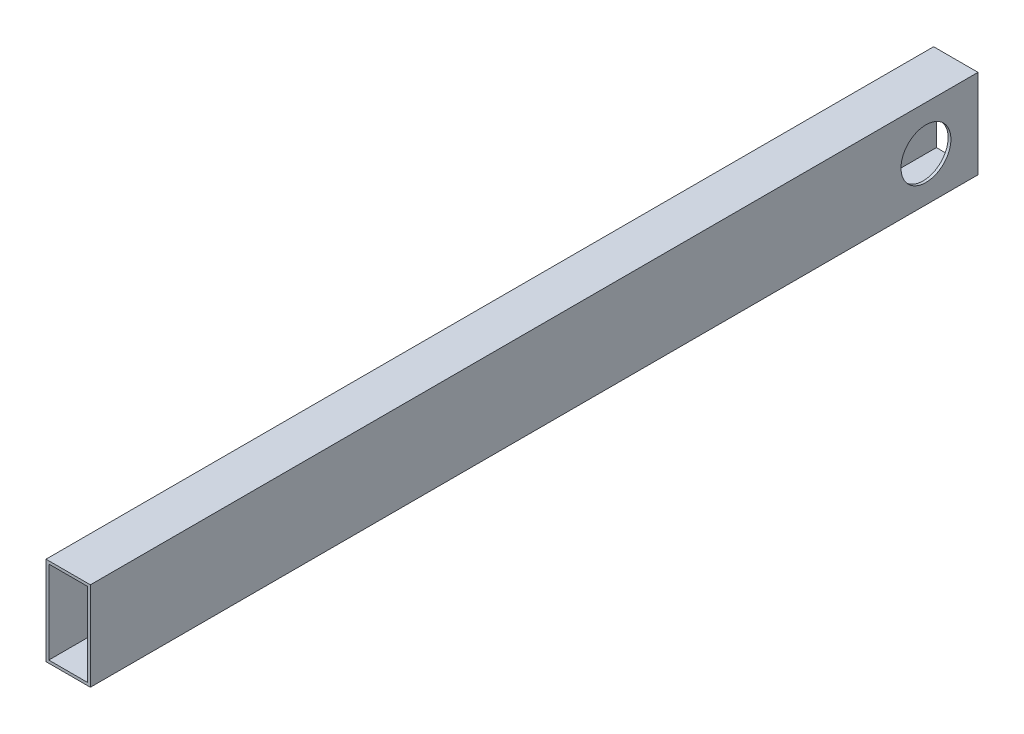
ISO-10303-21;
HEADER;
FILE_DESCRIPTION(('STEP AP214'),'2;1');
FILE_NAME('part.step','',(''),(''),'','','');
FILE_SCHEMA(('AUTOMOTIVE_DESIGN { 1 0 10303 214 1 1 1 1 }'));
ENDSEC;
DATA;
#1=APPLICATION_CONTEXT('core data for automotive mechanical design processes');
#2=APPLICATION_PROTOCOL_DEFINITION('international standard','automotive_design',2000,#1);
#3=PRODUCT_CONTEXT('',#1,'mechanical');
#4=PRODUCT('Part','Part','',(#3));
#5=PRODUCT_RELATED_PRODUCT_CATEGORY('part','',(#4));
#6=PRODUCT_DEFINITION_FORMATION('','',#4);
#7=PRODUCT_DEFINITION_CONTEXT('part definition',#1,'design');
#8=PRODUCT_DEFINITION('design','',#6,#7);
#9=PRODUCT_DEFINITION_SHAPE('','',#8);
#10=(LENGTH_UNIT() NAMED_UNIT(*) SI_UNIT(.MILLI.,.METRE.));
#11=(NAMED_UNIT(*) PLANE_ANGLE_UNIT() SI_UNIT($,.RADIAN.));
#12=(NAMED_UNIT(*) SI_UNIT($,.STERADIAN.) SOLID_ANGLE_UNIT());
#13=UNCERTAINTY_MEASURE_WITH_UNIT(LENGTH_MEASURE(1.E-05),#10,'distance_accuracy_value','');
#14=(GEOMETRIC_REPRESENTATION_CONTEXT(3) GLOBAL_UNCERTAINTY_ASSIGNED_CONTEXT((#13)) GLOBAL_UNIT_ASSIGNED_CONTEXT((#10,
#11,#12)) REPRESENTATION_CONTEXT('',''));
#15=CARTESIAN_POINT('',(0.,0.,0.));
#16=DIRECTION('',(0.,0.,1.));
#17=DIRECTION('',(1.,0.,0.));
#18=AXIS2_PLACEMENT_3D('',#15,#16,#17);
#19=CARTESIAN_POINT('',(0.,0.,254.));
#20=DIRECTION('',(0.,0.,-1.));
#21=DIRECTION('',(-1.,0.,0.));
#22=AXIS2_PLACEMENT_3D('',#19,#20,#21);
#23=PLANE('',#22);
#24=DIRECTION('',(0.,1.,0.));
#25=VECTOR('',#24,1.);
#26=CARTESIAN_POINT('',(12.7,-25.4,254.));
#27=LINE('',#26,#25);
#28=CARTESIAN_POINT('',(12.7,-25.4,254.));
#29=VERTEX_POINT('',#28);
#30=CARTESIAN_POINT('',(12.7,25.4,254.));
#31=VERTEX_POINT('',#30);
#32=EDGE_CURVE('E155',#29,#31,#27,.T.);
#33=ORIENTED_EDGE('',*,*,#32,.T.);
#34=DIRECTION('',(-1.,0.,0.));
#35=VECTOR('',#34,1.);
#36=CARTESIAN_POINT('',(-12.7,25.4,254.));
#37=LINE('',#36,#35);
#38=CARTESIAN_POINT('',(-12.7,25.4,254.));
#39=VERTEX_POINT('',#38);
#40=EDGE_CURVE('E159',#31,#39,#37,.T.);
#41=ORIENTED_EDGE('',*,*,#40,.T.);
#42=DIRECTION('',(0.,-1.,0.));
#43=VECTOR('',#42,1.);
#44=CARTESIAN_POINT('',(-12.7,-25.4,254.));
#45=LINE('',#44,#43);
#46=CARTESIAN_POINT('',(-12.7,-25.4,254.));
#47=VERTEX_POINT('',#46);
#48=EDGE_CURVE('E163',#39,#47,#45,.T.);
#49=ORIENTED_EDGE('',*,*,#48,.T.);
#50=DIRECTION('',(1.,0.,0.));
#51=VECTOR('',#50,1.);
#52=CARTESIAN_POINT('',(-12.7,-25.4,254.));
#53=LINE('',#52,#51);
#54=EDGE_CURVE('E166',#47,#29,#53,.T.);
#55=ORIENTED_EDGE('',*,*,#54,.T.);
#56=EDGE_LOOP('',(#33,#41,#49,#55));
#57=FACE_BOUND('',#56,.T.);
#58=DIRECTION('',(1.,0.,0.));
#59=VECTOR('',#58,1.);
#60=CARTESIAN_POINT('',(-11.1125,-23.8125,254.));
#61=LINE('',#60,#59);
#62=CARTESIAN_POINT('',(-11.1125,-23.8125,254.));
#63=VERTEX_POINT('',#62);
#64=CARTESIAN_POINT('',(11.1125,-23.8125,254.));
#65=VERTEX_POINT('',#64);
#66=EDGE_CURVE('E105',#63,#65,#61,.T.);
#67=ORIENTED_EDGE('',*,*,#66,.F.);
#68=DIRECTION('',(0.,-1.,0.));
#69=VECTOR('',#68,1.);
#70=CARTESIAN_POINT('',(-11.1125,-23.8125,254.));
#71=LINE('',#70,#69);
#72=CARTESIAN_POINT('',(-11.1125,23.8125,254.));
#73=VERTEX_POINT('',#72);
#74=EDGE_CURVE('E131',#73,#63,#71,.T.);
#75=ORIENTED_EDGE('',*,*,#74,.F.);
#76=DIRECTION('',(-1.,0.,0.));
#77=VECTOR('',#76,1.);
#78=CARTESIAN_POINT('',(-11.1125,23.8125,254.));
#79=LINE('',#78,#77);
#80=CARTESIAN_POINT('',(11.1125,23.8125,254.));
#81=VERTEX_POINT('',#80);
#82=EDGE_CURVE('E127',#81,#73,#79,.T.);
#83=ORIENTED_EDGE('',*,*,#82,.F.);
#84=DIRECTION('',(0.,1.,0.));
#85=VECTOR('',#84,1.);
#86=CARTESIAN_POINT('',(11.1125,-23.8125,254.));
#87=LINE('',#86,#85);
#88=EDGE_CURVE('E114',#65,#81,#87,.T.);
#89=ORIENTED_EDGE('',*,*,#88,.F.);
#90=EDGE_LOOP('',(#67,#75,#83,#89));
#91=FACE_BOUND('',#90,.T.);
#92=ADVANCED_FACE('F38',(#57,#91),#23,.F.);
#93=CARTESIAN_POINT('',(0.,0.,-254.));
#94=DIRECTION('',(0.,0.,-1.));
#95=DIRECTION('',(-1.,0.,0.));
#96=AXIS2_PLACEMENT_3D('',#93,#94,#95);
#97=PLANE('',#96);
#98=DIRECTION('',(0.,1.,0.));
#99=VECTOR('',#98,1.);
#100=CARTESIAN_POINT('',(12.7,-25.4,-254.));
#101=LINE('',#100,#99);
#102=CARTESIAN_POINT('',(12.7,-25.4,-254.));
#103=VERTEX_POINT('',#102);
#104=CARTESIAN_POINT('',(12.7,25.4,-254.));
#105=VERTEX_POINT('',#104);
#106=EDGE_CURVE('E123',#103,#105,#101,.T.);
#107=ORIENTED_EDGE('',*,*,#106,.F.);
#108=DIRECTION('',(1.,0.,0.));
#109=VECTOR('',#108,1.);
#110=CARTESIAN_POINT('',(-12.7,-25.4,-254.));
#111=LINE('',#110,#109);
#112=CARTESIAN_POINT('',(-12.7,-25.4,-254.));
#113=VERTEX_POINT('',#112);
#114=EDGE_CURVE('E160',#113,#103,#111,.T.);
#115=ORIENTED_EDGE('',*,*,#114,.F.);
#116=DIRECTION('',(0.,-1.,0.));
#117=VECTOR('',#116,1.);
#118=CARTESIAN_POINT('',(-12.7,-25.4,-254.));
#119=LINE('',#118,#117);
#120=CARTESIAN_POINT('',(-12.7,25.4,-254.));
#121=VERTEX_POINT('',#120);
#122=EDGE_CURVE('E176',#121,#113,#119,.T.);
#123=ORIENTED_EDGE('',*,*,#122,.F.);
#124=DIRECTION('',(-1.,0.,0.));
#125=VECTOR('',#124,1.);
#126=CARTESIAN_POINT('',(-12.7,25.4,-254.));
#127=LINE('',#126,#125);
#128=EDGE_CURVE('E173',#105,#121,#127,.T.);
#129=ORIENTED_EDGE('',*,*,#128,.F.);
#130=EDGE_LOOP('',(#107,#115,#123,#129));
#131=FACE_BOUND('',#130,.T.);
#132=DIRECTION('',(0.,-1.,0.));
#133=VECTOR('',#132,1.);
#134=CARTESIAN_POINT('',(-11.1125,-23.8125,-254.));
#135=LINE('',#134,#133);
#136=CARTESIAN_POINT('',(-11.1125,23.8125,-254.));
#137=VERTEX_POINT('',#136);
#138=CARTESIAN_POINT('',(-11.1125,-23.8125,-254.));
#139=VERTEX_POINT('',#138);
#140=EDGE_CURVE('E115',#137,#139,#135,.T.);
#141=ORIENTED_EDGE('',*,*,#140,.T.);
#142=DIRECTION('',(1.,0.,0.));
#143=VECTOR('',#142,1.);
#144=CARTESIAN_POINT('',(-11.1125,-23.8125,-254.));
#145=LINE('',#144,#143);
#146=CARTESIAN_POINT('',(11.1125,-23.8125,-254.));
#147=VERTEX_POINT('',#146);
#148=EDGE_CURVE('E63',#139,#147,#145,.T.);
#149=ORIENTED_EDGE('',*,*,#148,.T.);
#150=DIRECTION('',(0.,1.,0.));
#151=VECTOR('',#150,1.);
#152=CARTESIAN_POINT('',(11.1125,-23.8125,-254.));
#153=LINE('',#152,#151);
#154=CARTESIAN_POINT('',(11.1125,23.8125,-254.));
#155=VERTEX_POINT('',#154);
#156=EDGE_CURVE('E121',#147,#155,#153,.T.);
#157=ORIENTED_EDGE('',*,*,#156,.T.);
#158=DIRECTION('',(-1.,0.,0.));
#159=VECTOR('',#158,1.);
#160=CARTESIAN_POINT('',(-11.1125,23.8125,-254.));
#161=LINE('',#160,#159);
#162=EDGE_CURVE('E142',#155,#137,#161,.T.);
#163=ORIENTED_EDGE('',*,*,#162,.T.);
#164=EDGE_LOOP('',(#141,#149,#157,#163));
#165=FACE_BOUND('',#164,.T.);
#166=ADVANCED_FACE('F200',(#131,#165),#97,.T.);
#167=CARTESIAN_POINT('',(12.7,-25.4,254.));
#168=DIRECTION('',(-1.,0.,0.));
#169=DIRECTION('',(0.,0.,1.));
#170=AXIS2_PLACEMENT_3D('',#167,#168,#169);
#171=PLANE('',#170);
#172=CARTESIAN_POINT('',(12.7,0.,-224.210207487407));
#173=DIRECTION('',(1.,0.,0.));
#174=DIRECTION('',(0.,0.,-1.));
#175=AXIS2_PLACEMENT_3D('',#172,#173,#174);
#176=CIRCLE('',#175,14.2875);
#177=CARTESIAN_POINT('',(12.7,0.,-238.497707487407));
#178=VERTEX_POINT('',#177);
#179=EDGE_CURVE('E266',#178,#178,#176,.T.);
#180=ORIENTED_EDGE('',*,*,#179,.F.);
#181=EDGE_LOOP('',(#180));
#182=FACE_BOUND('',#181,.T.);
#183=ORIENTED_EDGE('',*,*,#106,.T.);
#184=DIRECTION('',(0.,0.,-1.));
#185=VECTOR('',#184,1.);
#186=CARTESIAN_POINT('',(12.7,25.4,254.));
#187=LINE('',#186,#185);
#188=EDGE_CURVE('E11',#31,#105,#187,.T.);
#189=ORIENTED_EDGE('',*,*,#188,.F.);
#190=ORIENTED_EDGE('',*,*,#32,.F.);
#191=DIRECTION('',(0.,0.,-1.));
#192=VECTOR('',#191,1.);
#193=CARTESIAN_POINT('',(12.7,-25.4,254.));
#194=LINE('',#193,#192);
#195=EDGE_CURVE('E169',#29,#103,#194,.T.);
#196=ORIENTED_EDGE('',*,*,#195,.T.);
#197=EDGE_LOOP('',(#183,#189,#190,#196));
#198=FACE_BOUND('',#197,.T.);
#199=ADVANCED_FACE('F40',(#182,#198),#171,.F.);
#200=CARTESIAN_POINT('',(-12.7,25.4,254.));
#201=DIRECTION('',(0.,-1.,0.));
#202=DIRECTION('',(0.,0.,-1.));
#203=AXIS2_PLACEMENT_3D('',#200,#201,#202);
#204=PLANE('',#203);
#205=ORIENTED_EDGE('',*,*,#128,.T.);
#206=DIRECTION('',(0.,0.,-1.));
#207=VECTOR('',#206,1.);
#208=CARTESIAN_POINT('',(-12.7,25.4,254.));
#209=LINE('',#208,#207);
#210=EDGE_CURVE('E48',#39,#121,#209,.T.);
#211=ORIENTED_EDGE('',*,*,#210,.F.);
#212=ORIENTED_EDGE('',*,*,#40,.F.);
#213=ORIENTED_EDGE('',*,*,#188,.T.);
#214=EDGE_LOOP('',(#205,#211,#212,#213));
#215=FACE_BOUND('',#214,.T.);
#216=ADVANCED_FACE('F210',(#215),#204,.F.);
#217=CARTESIAN_POINT('',(-12.7,-25.4,254.));
#218=DIRECTION('',(1.,0.,0.));
#219=DIRECTION('',(0.,0.,-1.));
#220=AXIS2_PLACEMENT_3D('',#217,#218,#219);
#221=PLANE('',#220);
#222=CARTESIAN_POINT('',(-12.7,0.,-224.210207487407));
#223=DIRECTION('',(1.,0.,0.));
#224=DIRECTION('',(0.,0.,-1.));
#225=AXIS2_PLACEMENT_3D('',#222,#223,#224);
#226=CIRCLE('',#225,14.2875);
#227=CARTESIAN_POINT('',(-12.7,0.,-238.497707487407));
#228=VERTEX_POINT('',#227);
#229=EDGE_CURVE('E264',#228,#228,#226,.T.);
#230=ORIENTED_EDGE('',*,*,#229,.T.);
#231=EDGE_LOOP('',(#230));
#232=FACE_BOUND('',#231,.T.);
#233=ORIENTED_EDGE('',*,*,#122,.T.);
#234=DIRECTION('',(0.,0.,-1.));
#235=VECTOR('',#234,1.);
#236=CARTESIAN_POINT('',(-12.7,-25.4,254.));
#237=LINE('',#236,#235);
#238=EDGE_CURVE('E184',#47,#113,#237,.T.);
#239=ORIENTED_EDGE('',*,*,#238,.F.);
#240=ORIENTED_EDGE('',*,*,#48,.F.);
#241=ORIENTED_EDGE('',*,*,#210,.T.);
#242=EDGE_LOOP('',(#233,#239,#240,#241));
#243=FACE_BOUND('',#242,.T.);
#244=ADVANCED_FACE('F194',(#232,#243),#221,.F.);
#245=CARTESIAN_POINT('',(-12.7,-25.4,254.));
#246=DIRECTION('',(0.,1.,0.));
#247=DIRECTION('',(0.,0.,1.));
#248=AXIS2_PLACEMENT_3D('',#245,#246,#247);
#249=PLANE('',#248);
#250=ORIENTED_EDGE('',*,*,#114,.T.);
#251=ORIENTED_EDGE('',*,*,#195,.F.);
#252=ORIENTED_EDGE('',*,*,#54,.F.);
#253=ORIENTED_EDGE('',*,*,#238,.T.);
#254=EDGE_LOOP('',(#250,#251,#252,#253));
#255=FACE_BOUND('',#254,.T.);
#256=ADVANCED_FACE('F204',(#255),#249,.F.);
#257=CARTESIAN_POINT('',(-11.1125,-23.8125,254.));
#258=DIRECTION('',(0.,1.,0.));
#259=DIRECTION('',(0.,0.,1.));
#260=AXIS2_PLACEMENT_3D('',#257,#258,#259);
#261=PLANE('',#260);
#262=ORIENTED_EDGE('',*,*,#148,.F.);
#263=DIRECTION('',(0.,0.,-1.));
#264=VECTOR('',#263,1.);
#265=CARTESIAN_POINT('',(-11.1125,-23.8125,254.));
#266=LINE('',#265,#264);
#267=EDGE_CURVE('E109',#63,#139,#266,.T.);
#268=ORIENTED_EDGE('',*,*,#267,.F.);
#269=ORIENTED_EDGE('',*,*,#66,.T.);
#270=DIRECTION('',(0.,0.,-1.));
#271=VECTOR('',#270,1.);
#272=CARTESIAN_POINT('',(11.1125,-23.8125,254.));
#273=LINE('',#272,#271);
#274=EDGE_CURVE('E108',#65,#147,#273,.T.);
#275=ORIENTED_EDGE('',*,*,#274,.T.);
#276=EDGE_LOOP('',(#262,#268,#269,#275));
#277=FACE_BOUND('',#276,.T.);
#278=ADVANCED_FACE('F107',(#277),#261,.T.);
#279=CARTESIAN_POINT('',(11.1125,-23.8125,254.));
#280=DIRECTION('',(-1.,0.,0.));
#281=DIRECTION('',(0.,-1.,0.));
#282=AXIS2_PLACEMENT_3D('',#279,#280,#281);
#283=PLANE('',#282);
#284=CARTESIAN_POINT('',(11.1125,0.,-224.210207487407));
#285=DIRECTION('',(-1.,0.,0.));
#286=DIRECTION('',(0.,-1.,0.));
#287=AXIS2_PLACEMENT_3D('',#284,#285,#286);
#288=CIRCLE('',#287,14.2875);
#289=CARTESIAN_POINT('',(11.1125,-14.2875,-224.210207487407));
#290=VERTEX_POINT('',#289);
#291=EDGE_CURVE('E139',#290,#290,#288,.T.);
#292=ORIENTED_EDGE('',*,*,#291,.F.);
#293=EDGE_LOOP('',(#292));
#294=FACE_BOUND('',#293,.T.);
#295=ORIENTED_EDGE('',*,*,#156,.F.);
#296=ORIENTED_EDGE('',*,*,#274,.F.);
#297=ORIENTED_EDGE('',*,*,#88,.T.);
#298=DIRECTION('',(0.,0.,-1.));
#299=VECTOR('',#298,1.);
#300=CARTESIAN_POINT('',(11.1125,23.8125,254.));
#301=LINE('',#300,#299);
#302=EDGE_CURVE('E124',#81,#155,#301,.T.);
#303=ORIENTED_EDGE('',*,*,#302,.T.);
#304=EDGE_LOOP('',(#295,#296,#297,#303));
#305=FACE_BOUND('',#304,.T.);
#306=ADVANCED_FACE('F118',(#294,#305),#283,.T.);
#307=CARTESIAN_POINT('',(-11.1125,23.8125,254.));
#308=DIRECTION('',(0.,-1.,0.));
#309=DIRECTION('',(0.,0.,-1.));
#310=AXIS2_PLACEMENT_3D('',#307,#308,#309);
#311=PLANE('',#310);
#312=ORIENTED_EDGE('',*,*,#162,.F.);
#313=ORIENTED_EDGE('',*,*,#302,.F.);
#314=ORIENTED_EDGE('',*,*,#82,.T.);
#315=DIRECTION('',(0.,0.,-1.));
#316=VECTOR('',#315,1.);
#317=CARTESIAN_POINT('',(-11.1125,23.8125,254.));
#318=LINE('',#317,#316);
#319=EDGE_CURVE('E55',#73,#137,#318,.T.);
#320=ORIENTED_EDGE('',*,*,#319,.T.);
#321=EDGE_LOOP('',(#312,#313,#314,#320));
#322=FACE_BOUND('',#321,.T.);
#323=ADVANCED_FACE('F238',(#322),#311,.T.);
#324=CARTESIAN_POINT('',(-11.1125,-23.8125,254.));
#325=DIRECTION('',(1.,0.,0.));
#326=DIRECTION('',(0.,0.,-1.));
#327=AXIS2_PLACEMENT_3D('',#324,#325,#326);
#328=PLANE('',#327);
#329=CARTESIAN_POINT('',(-11.1125,0.,-224.210207487407));
#330=DIRECTION('',(1.,0.,0.));
#331=DIRECTION('',(0.,0.,-1.));
#332=AXIS2_PLACEMENT_3D('',#329,#330,#331);
#333=CIRCLE('',#332,14.2875);
#334=CARTESIAN_POINT('',(-11.1125,0.,-238.497707487407));
#335=VERTEX_POINT('',#334);
#336=EDGE_CURVE('E42',#335,#335,#333,.T.);
#337=ORIENTED_EDGE('',*,*,#336,.F.);
#338=EDGE_LOOP('',(#337));
#339=FACE_BOUND('',#338,.T.);
#340=ORIENTED_EDGE('',*,*,#140,.F.);
#341=ORIENTED_EDGE('',*,*,#319,.F.);
#342=ORIENTED_EDGE('',*,*,#74,.T.);
#343=ORIENTED_EDGE('',*,*,#267,.T.);
#344=EDGE_LOOP('',(#340,#341,#342,#343));
#345=FACE_BOUND('',#344,.T.);
#346=ADVANCED_FACE('F243',(#339,#345),#328,.T.);
#347=CARTESIAN_POINT('',(-12.7,0.,-224.210207487407));
#348=DIRECTION('',(1.,0.,0.));
#349=DIRECTION('',(0.,0.,-1.));
#350=AXIS2_PLACEMENT_3D('',#347,#348,#349);
#351=CYLINDRICAL_SURFACE('',#350,14.2875);
#352=ORIENTED_EDGE('',*,*,#336,.T.);
#353=EDGE_LOOP('',(#352));
#354=FACE_BOUND('',#353,.T.);
#355=ORIENTED_EDGE('',*,*,#229,.F.);
#356=EDGE_LOOP('',(#355));
#357=FACE_BOUND('',#356,.T.);
#358=ADVANCED_FACE('F249',(#354,#357),#351,.F.);
#359=ORIENTED_EDGE('',*,*,#291,.T.);
#360=EDGE_LOOP('',(#359));
#361=FACE_BOUND('',#360,.T.);
#362=ORIENTED_EDGE('',*,*,#179,.T.);
#363=EDGE_LOOP('',(#362));
#364=FACE_BOUND('',#363,.T.);
#365=ADVANCED_FACE('F252',(#361,#364),#351,.F.);
#366=CLOSED_SHELL('',(#92,#166,#199,#216,#244,#256,#278,#306,#323,#346,#358,#365));
#367=MANIFOLD_SOLID_BREP('B2',#366);
#368=ADVANCED_BREP_SHAPE_REPRESENTATION('',(#18,#367),#14);
#369=SHAPE_DEFINITION_REPRESENTATION(#9,#368);
ENDSEC;
END-ISO-10303-21;
